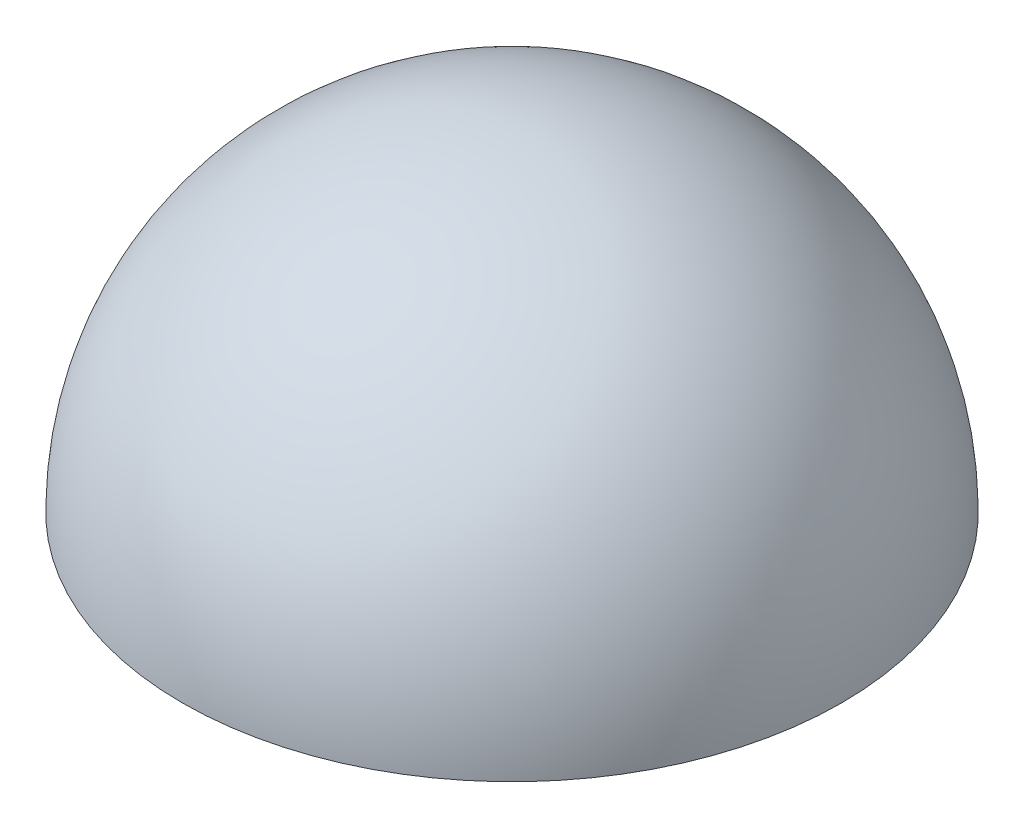
ISO-10303-21;
HEADER;
FILE_DESCRIPTION(('STEP AP214'),'2;1');
FILE_NAME('part.step','',(''),(''),'','','');
FILE_SCHEMA(('AUTOMOTIVE_DESIGN { 1 0 10303 214 1 1 1 1 }'));
ENDSEC;
DATA;
#1=APPLICATION_CONTEXT('core data for automotive mechanical design processes');
#2=APPLICATION_PROTOCOL_DEFINITION('international standard','automotive_design',2000,#1);
#3=PRODUCT_CONTEXT('',#1,'mechanical');
#4=PRODUCT('Part','Part','',(#3));
#5=PRODUCT_RELATED_PRODUCT_CATEGORY('part','',(#4));
#6=PRODUCT_DEFINITION_FORMATION('','',#4);
#7=PRODUCT_DEFINITION_CONTEXT('part definition',#1,'design');
#8=PRODUCT_DEFINITION('design','',#6,#7);
#9=PRODUCT_DEFINITION_SHAPE('','',#8);
#10=(LENGTH_UNIT() NAMED_UNIT(*) SI_UNIT(.MILLI.,.METRE.));
#11=(NAMED_UNIT(*) PLANE_ANGLE_UNIT() SI_UNIT($,.RADIAN.));
#12=(NAMED_UNIT(*) SI_UNIT($,.STERADIAN.) SOLID_ANGLE_UNIT());
#13=UNCERTAINTY_MEASURE_WITH_UNIT(LENGTH_MEASURE(1.E-05),#10,'distance_accuracy_value','');
#14=(GEOMETRIC_REPRESENTATION_CONTEXT(3) GLOBAL_UNCERTAINTY_ASSIGNED_CONTEXT((#13)) GLOBAL_UNIT_ASSIGNED_CONTEXT((#10,
#11,#12)) REPRESENTATION_CONTEXT('',''));
#15=CARTESIAN_POINT('',(0.,0.,0.));
#16=DIRECTION('',(0.,0.,1.));
#17=DIRECTION('',(1.,0.,0.));
#18=AXIS2_PLACEMENT_3D('',#15,#16,#17);
#19=CARTESIAN_POINT('',(0.,0.,0.));
#20=DIRECTION('',(0.,1.,0.));
#21=DIRECTION('',(1.,0.,0.));
#22=AXIS2_PLACEMENT_3D('',#19,#20,#21);
#23=SPHERICAL_SURFACE('',#22,80.);
#24=CARTESIAN_POINT('',(0.,0.,0.));
#25=DIRECTION('',(0.,1.,0.));
#26=DIRECTION('',(-1.,0.,0.));
#27=AXIS2_PLACEMENT_3D('',#24,#25,#26);
#28=CIRCLE('',#27,80.);
#29=CARTESIAN_POINT('',(-80.,0.,0.));
#30=VERTEX_POINT('',#29);
#31=EDGE_CURVE('E10',#30,#30,#28,.T.);
#32=ORIENTED_EDGE('',*,*,#31,.T.);
#33=EDGE_LOOP('',(#32));
#34=FACE_BOUND('',#33,.T.);
#35=ADVANCED_FACE('F43',(#34),#23,.T.);
#36=CARTESIAN_POINT('',(0.,0.,0.));
#37=DIRECTION('',(0.,1.,0.));
#38=DIRECTION('',(-1.,0.,0.));
#39=AXIS2_PLACEMENT_3D('',#36,#37,#38);
#40=PLANE('',#39);
#41=CARTESIAN_POINT('',(0.,0.,0.));
#42=DIRECTION('',(0.,1.,0.));
#43=DIRECTION('',(-1.,0.,0.));
#44=AXIS2_PLACEMENT_3D('',#41,#42,#43);
#45=CIRCLE('',#44,79.);
#46=CARTESIAN_POINT('',(-79.,0.,0.));
#47=VERTEX_POINT('',#46);
#48=EDGE_CURVE('E50',#47,#47,#45,.T.);
#49=ORIENTED_EDGE('',*,*,#48,.T.);
#50=EDGE_LOOP('',(#49));
#51=FACE_BOUND('',#50,.T.);
#52=ORIENTED_EDGE('',*,*,#31,.F.);
#53=EDGE_LOOP('',(#52));
#54=FACE_BOUND('',#53,.T.);
#55=ADVANCED_FACE('F57',(#51,#54),#40,.F.);
#56=CARTESIAN_POINT('',(0.,0.,0.));
#57=DIRECTION('',(0.,1.,0.));
#58=DIRECTION('',(1.,0.,0.));
#59=AXIS2_PLACEMENT_3D('',#56,#57,#58);
#60=SPHERICAL_SURFACE('',#59,79.);
#61=ORIENTED_EDGE('',*,*,#48,.F.);
#62=EDGE_LOOP('',(#61));
#63=FACE_BOUND('',#62,.T.);
#64=ADVANCED_FACE('F60',(#63),#60,.F.);
#65=CLOSED_SHELL('',(#35,#55,#64));
#66=MANIFOLD_SOLID_BREP('B2',#65);
#67=ADVANCED_BREP_SHAPE_REPRESENTATION('',(#18,#66),#14);
#68=SHAPE_DEFINITION_REPRESENTATION(#9,#67);
ENDSEC;
END-ISO-10303-21;
